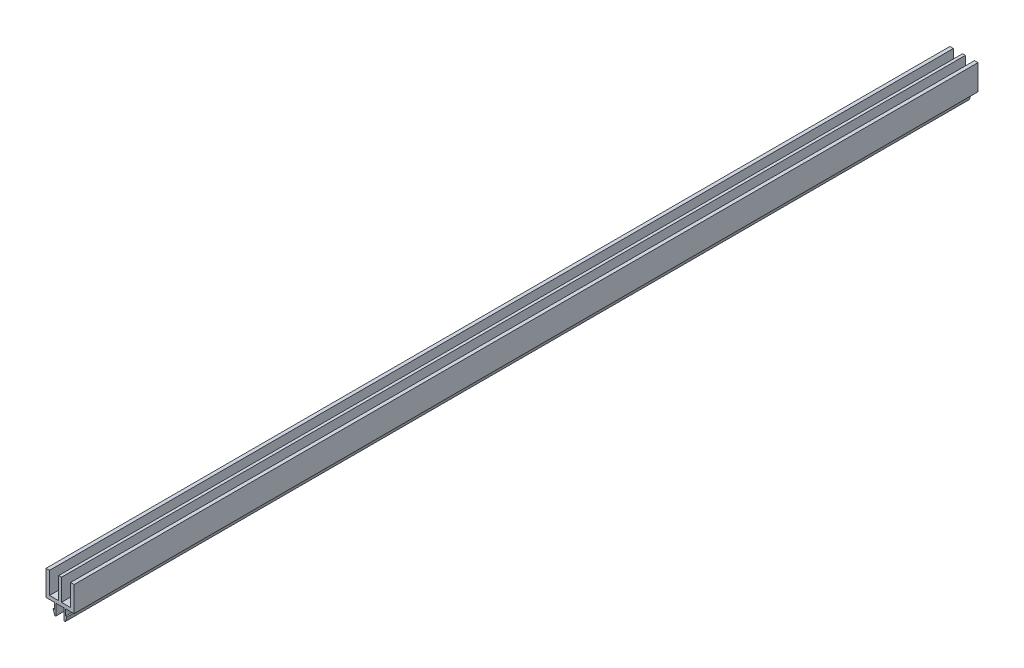
ISO-10303-21;
HEADER;
FILE_DESCRIPTION(('STEP AP214'),'2;1');
FILE_NAME('part.step','',(''),(''),'','','');
FILE_SCHEMA(('AUTOMOTIVE_DESIGN { 1 0 10303 214 1 1 1 1 }'));
ENDSEC;
DATA;
#1=APPLICATION_CONTEXT('core data for automotive mechanical design processes');
#2=APPLICATION_PROTOCOL_DEFINITION('international standard','automotive_design',2000,#1);
#3=PRODUCT_CONTEXT('',#1,'mechanical');
#4=PRODUCT('Part','Part','',(#3));
#5=PRODUCT_RELATED_PRODUCT_CATEGORY('part','',(#4));
#6=PRODUCT_DEFINITION_FORMATION('','',#4);
#7=PRODUCT_DEFINITION_CONTEXT('part definition',#1,'design');
#8=PRODUCT_DEFINITION('design','',#6,#7);
#9=PRODUCT_DEFINITION_SHAPE('','',#8);
#10=(LENGTH_UNIT() NAMED_UNIT(*) SI_UNIT(.MILLI.,.METRE.));
#11=(NAMED_UNIT(*) PLANE_ANGLE_UNIT() SI_UNIT($,.RADIAN.));
#12=(NAMED_UNIT(*) SI_UNIT($,.STERADIAN.) SOLID_ANGLE_UNIT());
#13=UNCERTAINTY_MEASURE_WITH_UNIT(LENGTH_MEASURE(1.E-05),#10,'distance_accuracy_value','');
#14=(GEOMETRIC_REPRESENTATION_CONTEXT(3) GLOBAL_UNCERTAINTY_ASSIGNED_CONTEXT((#13)) GLOBAL_UNIT_ASSIGNED_CONTEXT((#10,
#11,#12)) REPRESENTATION_CONTEXT('',''));
#15=CARTESIAN_POINT('',(0.,0.,0.));
#16=DIRECTION('',(0.,0.,1.));
#17=DIRECTION('',(1.,0.,0.));
#18=AXIS2_PLACEMENT_3D('',#15,#16,#17);
#19=CARTESIAN_POINT('',(-1.,17.9999999975,-594.));
#20=DIRECTION('',(-1.,0.,0.));
#21=DIRECTION('',(0.,-1.,0.));
#22=AXIS2_PLACEMENT_3D('',#19,#20,#21);
#23=PLANE('',#22);
#24=DIRECTION('',(0.,-1.,0.));
#25=VECTOR('',#24,1.);
#26=CARTESIAN_POINT('',(-1.,17.9999999975,50.));
#27=LINE('',#26,#25);
#28=CARTESIAN_POINT('',(-1.,17.9999999975,50.));
#29=VERTEX_POINT('',#28);
#30=CARTESIAN_POINT('',(-1.,2.4999999995,50.));
#31=VERTEX_POINT('',#30);
#32=EDGE_CURVE('E225',#29,#31,#27,.T.);
#33=ORIENTED_EDGE('',*,*,#32,.F.);
#34=DIRECTION('',(0.,0.,1.));
#35=VECTOR('',#34,1.);
#36=CARTESIAN_POINT('',(-1.,17.9999999975,-594.));
#37=LINE('',#36,#35);
#38=CARTESIAN_POINT('',(-1.,17.9999999975,-594.));
#39=VERTEX_POINT('',#38);
#40=EDGE_CURVE('E11',#39,#29,#37,.T.);
#41=ORIENTED_EDGE('',*,*,#40,.F.);
#42=DIRECTION('',(0.,-1.,0.));
#43=VECTOR('',#42,1.);
#44=CARTESIAN_POINT('',(-1.,17.9999999975,-594.));
#45=LINE('',#44,#43);
#46=CARTESIAN_POINT('',(-1.,2.4999999995,-594.));
#47=VERTEX_POINT('',#46);
#48=EDGE_CURVE('E293',#39,#47,#45,.T.);
#49=ORIENTED_EDGE('',*,*,#48,.T.);
#50=DIRECTION('',(0.,0.,1.));
#51=VECTOR('',#50,1.);
#52=CARTESIAN_POINT('',(-1.,2.4999999995,-594.));
#53=LINE('',#52,#51);
#54=EDGE_CURVE('E35',#47,#31,#53,.T.);
#55=ORIENTED_EDGE('',*,*,#54,.T.);
#56=EDGE_LOOP('',(#33,#41,#49,#55));
#57=FACE_BOUND('',#56,.T.);
#58=ADVANCED_FACE('F32',(#57),#23,.T.);
#59=CARTESIAN_POINT('',(0.999999999999998,17.9999999975,-594.));
#60=DIRECTION('',(0.,1.,0.));
#61=DIRECTION('',(0.,0.,1.));
#62=AXIS2_PLACEMENT_3D('',#59,#60,#61);
#63=PLANE('',#62);
#64=DIRECTION('',(-1.,0.,0.));
#65=VECTOR('',#64,1.);
#66=CARTESIAN_POINT('',(0.999999999999998,17.9999999975,50.));
#67=LINE('',#66,#65);
#68=CARTESIAN_POINT('',(0.999999999999998,17.9999999975,50.));
#69=VERTEX_POINT('',#68);
#70=EDGE_CURVE('E291',#69,#29,#67,.T.);
#71=ORIENTED_EDGE('',*,*,#70,.F.);
#72=DIRECTION('',(0.,0.,1.));
#73=VECTOR('',#72,1.);
#74=CARTESIAN_POINT('',(0.999999999999998,17.9999999975,-594.));
#75=LINE('',#74,#73);
#76=CARTESIAN_POINT('',(0.999999999999998,17.9999999975,-594.));
#77=VERTEX_POINT('',#76);
#78=EDGE_CURVE('E41',#77,#69,#75,.T.);
#79=ORIENTED_EDGE('',*,*,#78,.F.);
#80=DIRECTION('',(-1.,0.,0.));
#81=VECTOR('',#80,1.);
#82=CARTESIAN_POINT('',(0.999999999999998,17.9999999975,-594.));
#83=LINE('',#82,#81);
#84=EDGE_CURVE('E215',#77,#39,#83,.T.);
#85=ORIENTED_EDGE('',*,*,#84,.T.);
#86=ORIENTED_EDGE('',*,*,#40,.T.);
#87=EDGE_LOOP('',(#71,#79,#85,#86));
#88=FACE_BOUND('',#87,.T.);
#89=ADVANCED_FACE('F337',(#88),#63,.T.);
#90=CARTESIAN_POINT('',(0.999999999999998,2.4999999995,-594.));
#91=DIRECTION('',(1.,0.,0.));
#92=DIRECTION('',(0.,0.,-1.));
#93=AXIS2_PLACEMENT_3D('',#90,#91,#92);
#94=PLANE('',#93);
#95=DIRECTION('',(0.,1.,0.));
#96=VECTOR('',#95,1.);
#97=CARTESIAN_POINT('',(0.999999999999998,2.4999999995,50.));
#98=LINE('',#97,#96);
#99=CARTESIAN_POINT('',(0.999999999999998,2.4999999995,50.));
#100=VERTEX_POINT('',#99);
#101=EDGE_CURVE('E202',#100,#69,#98,.T.);
#102=ORIENTED_EDGE('',*,*,#101,.F.);
#103=DIRECTION('',(0.,0.,1.));
#104=VECTOR('',#103,1.);
#105=CARTESIAN_POINT('',(0.999999999999998,2.4999999995,-594.));
#106=LINE('',#105,#104);
#107=CARTESIAN_POINT('',(0.999999999999998,2.4999999995,-594.));
#108=VERTEX_POINT('',#107);
#109=EDGE_CURVE('E197',#108,#100,#106,.T.);
#110=ORIENTED_EDGE('',*,*,#109,.F.);
#111=DIRECTION('',(0.,1.,0.));
#112=VECTOR('',#111,1.);
#113=CARTESIAN_POINT('',(0.999999999999998,2.4999999995,-594.));
#114=LINE('',#113,#112);
#115=EDGE_CURVE('E200',#108,#77,#114,.T.);
#116=ORIENTED_EDGE('',*,*,#115,.T.);
#117=ORIENTED_EDGE('',*,*,#78,.T.);
#118=EDGE_LOOP('',(#102,#110,#116,#117));
#119=FACE_BOUND('',#118,.T.);
#120=ADVANCED_FACE('F199',(#119),#94,.T.);
#121=CARTESIAN_POINT('',(7.5,2.4999999995,-594.));
#122=DIRECTION('',(0.,1.,0.));
#123=DIRECTION('',(-1.,0.,0.));
#124=AXIS2_PLACEMENT_3D('',#121,#122,#123);
#125=PLANE('',#124);
#126=DIRECTION('',(-1.,0.,0.));
#127=VECTOR('',#126,1.);
#128=CARTESIAN_POINT('',(7.5,2.4999999995,50.));
#129=LINE('',#128,#127);
#130=CARTESIAN_POINT('',(7.5,2.4999999995,50.));
#131=VERTEX_POINT('',#130);
#132=EDGE_CURVE('E288',#131,#100,#129,.T.);
#133=ORIENTED_EDGE('',*,*,#132,.F.);
#134=DIRECTION('',(0.,0.,1.));
#135=VECTOR('',#134,1.);
#136=CARTESIAN_POINT('',(7.5,2.4999999995,-594.));
#137=LINE('',#136,#135);
#138=CARTESIAN_POINT('',(7.5,2.4999999995,-594.));
#139=VERTEX_POINT('',#138);
#140=EDGE_CURVE('E207',#139,#131,#137,.T.);
#141=ORIENTED_EDGE('',*,*,#140,.F.);
#142=DIRECTION('',(-1.,0.,0.));
#143=VECTOR('',#142,1.);
#144=CARTESIAN_POINT('',(7.5,2.4999999995,-594.));
#145=LINE('',#144,#143);
#146=EDGE_CURVE('E213',#139,#108,#145,.T.);
#147=ORIENTED_EDGE('',*,*,#146,.T.);
#148=ORIENTED_EDGE('',*,*,#109,.T.);
#149=EDGE_LOOP('',(#133,#141,#147,#148));
#150=FACE_BOUND('',#149,.T.);
#151=ADVANCED_FACE('F217',(#150),#125,.T.);
#152=CARTESIAN_POINT('',(7.5,17.9999999975,-594.));
#153=DIRECTION('',(-1.,0.,0.));
#154=DIRECTION('',(0.,-1.,0.));
#155=AXIS2_PLACEMENT_3D('',#152,#153,#154);
#156=PLANE('',#155);
#157=DIRECTION('',(0.,-1.,0.));
#158=VECTOR('',#157,1.);
#159=CARTESIAN_POINT('',(7.5,17.9999999975,50.));
#160=LINE('',#159,#158);
#161=CARTESIAN_POINT('',(7.5,17.9999999975,50.));
#162=VERTEX_POINT('',#161);
#163=EDGE_CURVE('E285',#162,#131,#160,.T.);
#164=ORIENTED_EDGE('',*,*,#163,.F.);
#165=DIRECTION('',(0.,0.,1.));
#166=VECTOR('',#165,1.);
#167=CARTESIAN_POINT('',(7.5,17.9999999975,-594.));
#168=LINE('',#167,#166);
#169=CARTESIAN_POINT('',(7.5,17.9999999975,-594.));
#170=VERTEX_POINT('',#169);
#171=EDGE_CURVE('E297',#170,#162,#168,.T.);
#172=ORIENTED_EDGE('',*,*,#171,.F.);
#173=DIRECTION('',(0.,-1.,0.));
#174=VECTOR('',#173,1.);
#175=CARTESIAN_POINT('',(7.5,17.9999999975,-594.));
#176=LINE('',#175,#174);
#177=EDGE_CURVE('E218',#170,#139,#176,.T.);
#178=ORIENTED_EDGE('',*,*,#177,.T.);
#179=ORIENTED_EDGE('',*,*,#140,.T.);
#180=EDGE_LOOP('',(#164,#172,#178,#179));
#181=FACE_BOUND('',#180,.T.);
#182=ADVANCED_FACE('F350',(#181),#156,.T.);
#183=CARTESIAN_POINT('',(10.,17.9999999975,-594.));
#184=DIRECTION('',(0.,1.,0.));
#185=DIRECTION('',(0.,0.,1.));
#186=AXIS2_PLACEMENT_3D('',#183,#184,#185);
#187=PLANE('',#186);
#188=DIRECTION('',(-1.,0.,0.));
#189=VECTOR('',#188,1.);
#190=CARTESIAN_POINT('',(10.,17.9999999975,50.));
#191=LINE('',#190,#189);
#192=CARTESIAN_POINT('',(10.,17.9999999975,50.));
#193=VERTEX_POINT('',#192);
#194=EDGE_CURVE('E282',#193,#162,#191,.T.);
#195=ORIENTED_EDGE('',*,*,#194,.F.);
#196=DIRECTION('',(0.,0.,1.));
#197=VECTOR('',#196,1.);
#198=CARTESIAN_POINT('',(10.,17.9999999975,-594.));
#199=LINE('',#198,#197);
#200=CARTESIAN_POINT('',(10.,17.9999999975,-594.));
#201=VERTEX_POINT('',#200);
#202=EDGE_CURVE('E299',#201,#193,#199,.T.);
#203=ORIENTED_EDGE('',*,*,#202,.F.);
#204=DIRECTION('',(-1.,0.,0.));
#205=VECTOR('',#204,1.);
#206=CARTESIAN_POINT('',(10.,17.9999999975,-594.));
#207=LINE('',#206,#205);
#208=EDGE_CURVE('E220',#201,#170,#207,.T.);
#209=ORIENTED_EDGE('',*,*,#208,.T.);
#210=ORIENTED_EDGE('',*,*,#171,.T.);
#211=EDGE_LOOP('',(#195,#203,#209,#210));
#212=FACE_BOUND('',#211,.T.);
#213=ADVANCED_FACE('F353',(#212),#187,.T.);
#214=CARTESIAN_POINT('',(10.,-4.99999828349541E-10,-594.));
#215=DIRECTION('',(1.,0.,0.));
#216=DIRECTION('',(0.,0.,-1.));
#217=AXIS2_PLACEMENT_3D('',#214,#215,#216);
#218=PLANE('',#217);
#219=DIRECTION('',(0.,1.,0.));
#220=VECTOR('',#219,1.);
#221=CARTESIAN_POINT('',(10.,-4.99999828349541E-10,50.));
#222=LINE('',#221,#220);
#223=CARTESIAN_POINT('',(10.,-4.99999828349541E-10,50.));
#224=VERTEX_POINT('',#223);
#225=EDGE_CURVE('E279',#224,#193,#222,.T.);
#226=ORIENTED_EDGE('',*,*,#225,.F.);
#227=DIRECTION('',(0.,0.,1.));
#228=VECTOR('',#227,1.);
#229=CARTESIAN_POINT('',(10.,-4.99999828349541E-10,-594.));
#230=LINE('',#229,#228);
#231=CARTESIAN_POINT('',(10.,-4.99999828349541E-10,-594.));
#232=VERTEX_POINT('',#231);
#233=EDGE_CURVE('E301',#232,#224,#230,.T.);
#234=ORIENTED_EDGE('',*,*,#233,.F.);
#235=DIRECTION('',(0.,1.,0.));
#236=VECTOR('',#235,1.);
#237=CARTESIAN_POINT('',(10.,-4.99999828349541E-10,-594.));
#238=LINE('',#237,#236);
#239=EDGE_CURVE('E643',#232,#201,#238,.T.);
#240=ORIENTED_EDGE('',*,*,#239,.T.);
#241=ORIENTED_EDGE('',*,*,#202,.T.);
#242=EDGE_LOOP('',(#226,#234,#240,#241));
#243=FACE_BOUND('',#242,.T.);
#244=ADVANCED_FACE('F357',(#243),#218,.T.);
#245=CARTESIAN_POINT('',(4.,-4.99999998002099E-10,-594.));
#246=DIRECTION('',(0.,-1.,0.));
#247=DIRECTION('',(1.,0.,0.));
#248=AXIS2_PLACEMENT_3D('',#245,#246,#247);
#249=PLANE('',#248);
#250=DIRECTION('',(1.,0.,0.));
#251=VECTOR('',#250,1.);
#252=CARTESIAN_POINT('',(4.,-4.99999998002099E-10,50.));
#253=LINE('',#252,#251);
#254=CARTESIAN_POINT('',(4.,-4.99999998002099E-10,50.));
#255=VERTEX_POINT('',#254);
#256=EDGE_CURVE('E276',#255,#224,#253,.T.);
#257=ORIENTED_EDGE('',*,*,#256,.F.);
#258=DIRECTION('',(0.,0.,1.));
#259=VECTOR('',#258,1.);
#260=CARTESIAN_POINT('',(4.,-4.99999998002099E-10,-594.));
#261=LINE('',#260,#259);
#262=CARTESIAN_POINT('',(4.,-4.99999998002099E-10,-594.));
#263=VERTEX_POINT('',#262);
#264=EDGE_CURVE('E303',#263,#255,#261,.T.);
#265=ORIENTED_EDGE('',*,*,#264,.F.);
#266=DIRECTION('',(1.,0.,0.));
#267=VECTOR('',#266,1.);
#268=CARTESIAN_POINT('',(4.,-4.99999998002099E-10,-594.));
#269=LINE('',#268,#267);
#270=EDGE_CURVE('E647',#263,#232,#269,.T.);
#271=ORIENTED_EDGE('',*,*,#270,.T.);
#272=ORIENTED_EDGE('',*,*,#233,.T.);
#273=EDGE_LOOP('',(#257,#265,#271,#272));
#274=FACE_BOUND('',#273,.T.);
#275=ADVANCED_FACE('F361',(#274),#249,.T.);
#276=CARTESIAN_POINT('',(4.,-4.5,-594.));
#277=DIRECTION('',(1.,0.,0.));
#278=DIRECTION('',(0.,0.,-1.));
#279=AXIS2_PLACEMENT_3D('',#276,#277,#278);
#280=PLANE('',#279);
#281=DIRECTION('',(0.,1.,0.));
#282=VECTOR('',#281,1.);
#283=CARTESIAN_POINT('',(4.,-4.5,50.));
#284=LINE('',#283,#282);
#285=CARTESIAN_POINT('',(4.,-4.5,50.));
#286=VERTEX_POINT('',#285);
#287=EDGE_CURVE('E273',#286,#255,#284,.T.);
#288=ORIENTED_EDGE('',*,*,#287,.F.);
#289=DIRECTION('',(0.,0.,1.));
#290=VECTOR('',#289,1.);
#291=CARTESIAN_POINT('',(4.,-4.5,-594.));
#292=LINE('',#291,#290);
#293=CARTESIAN_POINT('',(4.,-4.5,-594.));
#294=VERTEX_POINT('',#293);
#295=EDGE_CURVE('E305',#294,#286,#292,.T.);
#296=ORIENTED_EDGE('',*,*,#295,.F.);
#297=DIRECTION('',(0.,1.,0.));
#298=VECTOR('',#297,1.);
#299=CARTESIAN_POINT('',(4.,-4.5,-594.));
#300=LINE('',#299,#298);
#301=EDGE_CURVE('E636',#294,#263,#300,.T.);
#302=ORIENTED_EDGE('',*,*,#301,.T.);
#303=ORIENTED_EDGE('',*,*,#264,.T.);
#304=EDGE_LOOP('',(#288,#296,#302,#303));
#305=FACE_BOUND('',#304,.T.);
#306=ADVANCED_FACE('F365',(#305),#280,.T.);
#307=CARTESIAN_POINT('',(5.,-4.5,-594.));
#308=DIRECTION('',(0.,1.,0.));
#309=DIRECTION('',(0.,0.,1.));
#310=AXIS2_PLACEMENT_3D('',#307,#308,#309);
#311=PLANE('',#310);
#312=DIRECTION('',(-1.,0.,0.));
#313=VECTOR('',#312,1.);
#314=CARTESIAN_POINT('',(5.,-4.5,50.));
#315=LINE('',#314,#313);
#316=CARTESIAN_POINT('',(5.,-4.5,50.));
#317=VERTEX_POINT('',#316);
#318=EDGE_CURVE('E270',#317,#286,#315,.T.);
#319=ORIENTED_EDGE('',*,*,#318,.F.);
#320=DIRECTION('',(0.,0.,1.));
#321=VECTOR('',#320,1.);
#322=CARTESIAN_POINT('',(5.,-4.5,-594.));
#323=LINE('',#322,#321);
#324=CARTESIAN_POINT('',(5.,-4.5,-594.));
#325=VERTEX_POINT('',#324);
#326=EDGE_CURVE('E307',#325,#317,#323,.T.);
#327=ORIENTED_EDGE('',*,*,#326,.F.);
#328=DIRECTION('',(-1.,0.,0.));
#329=VECTOR('',#328,1.);
#330=CARTESIAN_POINT('',(5.,-4.5,-594.));
#331=LINE('',#330,#329);
#332=EDGE_CURVE('E632',#325,#294,#331,.T.);
#333=ORIENTED_EDGE('',*,*,#332,.T.);
#334=ORIENTED_EDGE('',*,*,#295,.T.);
#335=EDGE_LOOP('',(#319,#327,#333,#334));
#336=FACE_BOUND('',#335,.T.);
#337=ADVANCED_FACE('F369',(#336),#311,.T.);
#338=CARTESIAN_POINT('',(3.75,-8.,-594.));
#339=DIRECTION('',(0.941741911594837,-0.336336396998156,0.));
#340=DIRECTION('',(0.336336396998156,0.941741911594837,0.));
#341=AXIS2_PLACEMENT_3D('',#338,#339,#340);
#342=PLANE('',#341);
#343=DIRECTION('',(0.336336396998157,0.941741911594837,0.));
#344=VECTOR('',#343,1.);
#345=CARTESIAN_POINT('',(3.75,-8.,50.));
#346=LINE('',#345,#344);
#347=CARTESIAN_POINT('',(3.75,-8.,50.));
#348=VERTEX_POINT('',#347);
#349=EDGE_CURVE('E267',#348,#317,#346,.T.);
#350=ORIENTED_EDGE('',*,*,#349,.F.);
#351=DIRECTION('',(0.,0.,1.));
#352=VECTOR('',#351,1.);
#353=CARTESIAN_POINT('',(3.75,-8.,-594.));
#354=LINE('',#353,#352);
#355=CARTESIAN_POINT('',(3.75,-8.,-594.));
#356=VERTEX_POINT('',#355);
#357=EDGE_CURVE('E309',#356,#348,#354,.T.);
#358=ORIENTED_EDGE('',*,*,#357,.F.);
#359=DIRECTION('',(0.336336396998157,0.941741911594837,0.));
#360=VECTOR('',#359,1.);
#361=CARTESIAN_POINT('',(3.75,-8.,-594.));
#362=LINE('',#361,#360);
#363=EDGE_CURVE('E653',#356,#325,#362,.T.);
#364=ORIENTED_EDGE('',*,*,#363,.T.);
#365=ORIENTED_EDGE('',*,*,#326,.T.);
#366=EDGE_LOOP('',(#350,#358,#364,#365));
#367=FACE_BOUND('',#366,.T.);
#368=ADVANCED_FACE('F373',(#367),#342,.T.);
#369=CARTESIAN_POINT('',(3.,-8.,-594.));
#370=DIRECTION('',(0.,-1.,0.));
#371=DIRECTION('',(0.,0.,-1.));
#372=AXIS2_PLACEMENT_3D('',#369,#370,#371);
#373=PLANE('',#372);
#374=DIRECTION('',(1.,0.,0.));
#375=VECTOR('',#374,1.);
#376=CARTESIAN_POINT('',(3.,-8.,50.));
#377=LINE('',#376,#375);
#378=CARTESIAN_POINT('',(3.,-8.,50.));
#379=VERTEX_POINT('',#378);
#380=EDGE_CURVE('E264',#379,#348,#377,.T.);
#381=ORIENTED_EDGE('',*,*,#380,.F.);
#382=DIRECTION('',(0.,0.,1.));
#383=VECTOR('',#382,1.);
#384=CARTESIAN_POINT('',(3.,-8.,-594.));
#385=LINE('',#384,#383);
#386=CARTESIAN_POINT('',(3.,-8.,-594.));
#387=VERTEX_POINT('',#386);
#388=EDGE_CURVE('E311',#387,#379,#385,.T.);
#389=ORIENTED_EDGE('',*,*,#388,.F.);
#390=DIRECTION('',(1.,0.,0.));
#391=VECTOR('',#390,1.);
#392=CARTESIAN_POINT('',(3.,-8.,-594.));
#393=LINE('',#392,#391);
#394=EDGE_CURVE('E625',#387,#356,#393,.T.);
#395=ORIENTED_EDGE('',*,*,#394,.T.);
#396=ORIENTED_EDGE('',*,*,#357,.T.);
#397=EDGE_LOOP('',(#381,#389,#395,#396));
#398=FACE_BOUND('',#397,.T.);
#399=ADVANCED_FACE('F377',(#398),#373,.T.);
#400=CARTESIAN_POINT('',(3.,-4.9999985194348E-10,-594.));
#401=DIRECTION('',(-1.,0.,0.));
#402=DIRECTION('',(0.,0.,1.));
#403=AXIS2_PLACEMENT_3D('',#400,#401,#402);
#404=PLANE('',#403);
#405=DIRECTION('',(0.,-1.,0.));
#406=VECTOR('',#405,1.);
#407=CARTESIAN_POINT('',(3.,-4.9999985194348E-10,50.));
#408=LINE('',#407,#406);
#409=CARTESIAN_POINT('',(3.,-4.9999985194348E-10,50.));
#410=VERTEX_POINT('',#409);
#411=EDGE_CURVE('E261',#410,#379,#408,.T.);
#412=ORIENTED_EDGE('',*,*,#411,.F.);
#413=DIRECTION('',(0.,0.,1.));
#414=VECTOR('',#413,1.);
#415=CARTESIAN_POINT('',(3.,-4.9999985194348E-10,-594.));
#416=LINE('',#415,#414);
#417=CARTESIAN_POINT('',(3.,-4.9999985194348E-10,-594.));
#418=VERTEX_POINT('',#417);
#419=EDGE_CURVE('E313',#418,#410,#416,.T.);
#420=ORIENTED_EDGE('',*,*,#419,.F.);
#421=DIRECTION('',(0.,-1.,0.));
#422=VECTOR('',#421,1.);
#423=CARTESIAN_POINT('',(3.,-4.9999985194348E-10,-594.));
#424=LINE('',#423,#422);
#425=EDGE_CURVE('E621',#418,#387,#424,.T.);
#426=ORIENTED_EDGE('',*,*,#425,.T.);
#427=ORIENTED_EDGE('',*,*,#388,.T.);
#428=EDGE_LOOP('',(#412,#420,#426,#427));
#429=FACE_BOUND('',#428,.T.);
#430=ADVANCED_FACE('F381',(#429),#404,.T.);
#431=CARTESIAN_POINT('',(-3.,-4.99999455901012E-10,-594.));
#432=DIRECTION('',(0.,-1.,0.));
#433=DIRECTION('',(1.,0.,0.));
#434=AXIS2_PLACEMENT_3D('',#431,#432,#433);
#435=PLANE('',#434);
#436=DIRECTION('',(1.,0.,0.));
#437=VECTOR('',#436,1.);
#438=CARTESIAN_POINT('',(-3.,-4.99999455901012E-10,50.));
#439=LINE('',#438,#437);
#440=CARTESIAN_POINT('',(-3.,-4.99999455901012E-10,50.));
#441=VERTEX_POINT('',#440);
#442=EDGE_CURVE('E258',#441,#410,#439,.T.);
#443=ORIENTED_EDGE('',*,*,#442,.F.);
#444=DIRECTION('',(0.,0.,1.));
#445=VECTOR('',#444,1.);
#446=CARTESIAN_POINT('',(-3.,-4.99999455901012E-10,-594.));
#447=LINE('',#446,#445);
#448=CARTESIAN_POINT('',(-3.,-4.99999455901012E-10,-594.));
#449=VERTEX_POINT('',#448);
#450=EDGE_CURVE('E315',#449,#441,#447,.T.);
#451=ORIENTED_EDGE('',*,*,#450,.F.);
#452=DIRECTION('',(1.,0.,0.));
#453=VECTOR('',#452,1.);
#454=CARTESIAN_POINT('',(-3.,-4.99999455901012E-10,-594.));
#455=LINE('',#454,#453);
#456=EDGE_CURVE('E657',#449,#418,#455,.T.);
#457=ORIENTED_EDGE('',*,*,#456,.T.);
#458=ORIENTED_EDGE('',*,*,#419,.T.);
#459=EDGE_LOOP('',(#443,#451,#457,#458));
#460=FACE_BOUND('',#459,.T.);
#461=ADVANCED_FACE('F385',(#460),#435,.T.);
#462=CARTESIAN_POINT('',(-3.,-8.,-594.));
#463=DIRECTION('',(1.,0.,0.));
#464=DIRECTION('',(0.,0.,-1.));
#465=AXIS2_PLACEMENT_3D('',#462,#463,#464);
#466=PLANE('',#465);
#467=DIRECTION('',(0.,1.,0.));
#468=VECTOR('',#467,1.);
#469=CARTESIAN_POINT('',(-3.,-8.,50.));
#470=LINE('',#469,#468);
#471=CARTESIAN_POINT('',(-3.,-8.,50.));
#472=VERTEX_POINT('',#471);
#473=EDGE_CURVE('E255',#472,#441,#470,.T.);
#474=ORIENTED_EDGE('',*,*,#473,.F.);
#475=DIRECTION('',(0.,0.,1.));
#476=VECTOR('',#475,1.);
#477=CARTESIAN_POINT('',(-3.,-8.,-594.));
#478=LINE('',#477,#476);
#479=CARTESIAN_POINT('',(-3.,-8.,-594.));
#480=VERTEX_POINT('',#479);
#481=EDGE_CURVE('E317',#480,#472,#478,.T.);
#482=ORIENTED_EDGE('',*,*,#481,.F.);
#483=DIRECTION('',(0.,1.,0.));
#484=VECTOR('',#483,1.);
#485=CARTESIAN_POINT('',(-3.,-8.,-594.));
#486=LINE('',#485,#484);
#487=EDGE_CURVE('E614',#480,#449,#486,.T.);
#488=ORIENTED_EDGE('',*,*,#487,.T.);
#489=ORIENTED_EDGE('',*,*,#450,.T.);
#490=EDGE_LOOP('',(#474,#482,#488,#489));
#491=FACE_BOUND('',#490,.T.);
#492=ADVANCED_FACE('F389',(#491),#466,.T.);
#493=CARTESIAN_POINT('',(-3.75,-8.,-594.));
#494=DIRECTION('',(0.,-1.,0.));
#495=DIRECTION('',(0.,0.,-1.));
#496=AXIS2_PLACEMENT_3D('',#493,#494,#495);
#497=PLANE('',#496);
#498=DIRECTION('',(1.,0.,0.));
#499=VECTOR('',#498,1.);
#500=CARTESIAN_POINT('',(-3.75,-8.,50.));
#501=LINE('',#500,#499);
#502=CARTESIAN_POINT('',(-3.75,-8.,50.));
#503=VERTEX_POINT('',#502);
#504=EDGE_CURVE('E252',#503,#472,#501,.T.);
#505=ORIENTED_EDGE('',*,*,#504,.F.);
#506=DIRECTION('',(0.,0.,1.));
#507=VECTOR('',#506,1.);
#508=CARTESIAN_POINT('',(-3.75,-8.,-594.));
#509=LINE('',#508,#507);
#510=CARTESIAN_POINT('',(-3.75,-8.,-594.));
#511=VERTEX_POINT('',#510);
#512=EDGE_CURVE('E319',#511,#503,#509,.T.);
#513=ORIENTED_EDGE('',*,*,#512,.F.);
#514=DIRECTION('',(1.,0.,0.));
#515=VECTOR('',#514,1.);
#516=CARTESIAN_POINT('',(-3.75,-8.,-594.));
#517=LINE('',#516,#515);
#518=EDGE_CURVE('E610',#511,#480,#517,.T.);
#519=ORIENTED_EDGE('',*,*,#518,.T.);
#520=ORIENTED_EDGE('',*,*,#481,.T.);
#521=EDGE_LOOP('',(#505,#513,#519,#520));
#522=FACE_BOUND('',#521,.T.);
#523=ADVANCED_FACE('F393',(#522),#497,.T.);
#524=CARTESIAN_POINT('',(-5.,-4.5,-594.));
#525=DIRECTION('',(-0.941741911594837,-0.336336396998156,0.));
#526=DIRECTION('',(0.336336396998156,-0.941741911594837,0.));
#527=AXIS2_PLACEMENT_3D('',#524,#525,#526);
#528=PLANE('',#527);
#529=DIRECTION('',(0.336336396998156,-0.941741911594837,0.));
#530=VECTOR('',#529,1.);
#531=CARTESIAN_POINT('',(-5.,-4.5,50.));
#532=LINE('',#531,#530);
#533=CARTESIAN_POINT('',(-5.,-4.5,50.));
#534=VERTEX_POINT('',#533);
#535=EDGE_CURVE('E249',#534,#503,#532,.T.);
#536=ORIENTED_EDGE('',*,*,#535,.F.);
#537=DIRECTION('',(0.,0.,1.));
#538=VECTOR('',#537,1.);
#539=CARTESIAN_POINT('',(-5.,-4.5,-594.));
#540=LINE('',#539,#538);
#541=CARTESIAN_POINT('',(-5.,-4.5,-594.));
#542=VERTEX_POINT('',#541);
#543=EDGE_CURVE('E321',#542,#534,#540,.T.);
#544=ORIENTED_EDGE('',*,*,#543,.F.);
#545=DIRECTION('',(0.336336396998156,-0.941741911594837,0.));
#546=VECTOR('',#545,1.);
#547=CARTESIAN_POINT('',(-5.,-4.5,-594.));
#548=LINE('',#547,#546);
#549=EDGE_CURVE('E661',#542,#511,#548,.T.);
#550=ORIENTED_EDGE('',*,*,#549,.T.);
#551=ORIENTED_EDGE('',*,*,#512,.T.);
#552=EDGE_LOOP('',(#536,#544,#550,#551));
#553=FACE_BOUND('',#552,.T.);
#554=ADVANCED_FACE('F397',(#553),#528,.T.);
#555=CARTESIAN_POINT('',(-4.,-4.5,-594.));
#556=DIRECTION('',(0.,1.,0.));
#557=DIRECTION('',(0.,0.,1.));
#558=AXIS2_PLACEMENT_3D('',#555,#556,#557);
#559=PLANE('',#558);
#560=DIRECTION('',(-1.,0.,0.));
#561=VECTOR('',#560,1.);
#562=CARTESIAN_POINT('',(-4.,-4.5,50.));
#563=LINE('',#562,#561);
#564=CARTESIAN_POINT('',(-4.,-4.5,50.));
#565=VERTEX_POINT('',#564);
#566=EDGE_CURVE('E246',#565,#534,#563,.T.);
#567=ORIENTED_EDGE('',*,*,#566,.F.);
#568=DIRECTION('',(0.,0.,1.));
#569=VECTOR('',#568,1.);
#570=CARTESIAN_POINT('',(-4.,-4.5,-594.));
#571=LINE('',#570,#569);
#572=CARTESIAN_POINT('',(-4.,-4.5,-594.));
#573=VERTEX_POINT('',#572);
#574=EDGE_CURVE('E323',#573,#565,#571,.T.);
#575=ORIENTED_EDGE('',*,*,#574,.F.);
#576=DIRECTION('',(-1.,0.,0.));
#577=VECTOR('',#576,1.);
#578=CARTESIAN_POINT('',(-4.,-4.5,-594.));
#579=LINE('',#578,#577);
#580=EDGE_CURVE('E603',#573,#542,#579,.T.);
#581=ORIENTED_EDGE('',*,*,#580,.T.);
#582=ORIENTED_EDGE('',*,*,#543,.T.);
#583=EDGE_LOOP('',(#567,#575,#581,#582));
#584=FACE_BOUND('',#583,.T.);
#585=ADVANCED_FACE('F401',(#584),#559,.T.);
#586=CARTESIAN_POINT('',(-4.,-4.9999985194348E-10,-594.));
#587=DIRECTION('',(-1.,0.,0.));
#588=DIRECTION('',(0.,0.,1.));
#589=AXIS2_PLACEMENT_3D('',#586,#587,#588);
#590=PLANE('',#589);
#591=DIRECTION('',(0.,-1.,0.));
#592=VECTOR('',#591,1.);
#593=CARTESIAN_POINT('',(-4.,-4.9999985194348E-10,50.));
#594=LINE('',#593,#592);
#595=CARTESIAN_POINT('',(-4.,-4.9999985194348E-10,50.));
#596=VERTEX_POINT('',#595);
#597=EDGE_CURVE('E243',#596,#565,#594,.T.);
#598=ORIENTED_EDGE('',*,*,#597,.F.);
#599=DIRECTION('',(0.,0.,1.));
#600=VECTOR('',#599,1.);
#601=CARTESIAN_POINT('',(-4.,-4.9999985194348E-10,-594.));
#602=LINE('',#601,#600);
#603=CARTESIAN_POINT('',(-4.,-4.9999985194348E-10,-594.));
#604=VERTEX_POINT('',#603);
#605=EDGE_CURVE('E325',#604,#596,#602,.T.);
#606=ORIENTED_EDGE('',*,*,#605,.F.);
#607=DIRECTION('',(0.,-1.,0.));
#608=VECTOR('',#607,1.);
#609=CARTESIAN_POINT('',(-4.,-4.9999985194348E-10,-594.));
#610=LINE('',#609,#608);
#611=EDGE_CURVE('E599',#604,#573,#610,.T.);
#612=ORIENTED_EDGE('',*,*,#611,.T.);
#613=ORIENTED_EDGE('',*,*,#574,.T.);
#614=EDGE_LOOP('',(#598,#606,#612,#613));
#615=FACE_BOUND('',#614,.T.);
#616=ADVANCED_FACE('F405',(#615),#590,.T.);
#617=CARTESIAN_POINT('',(-10.,-4.99999719929324E-10,-594.));
#618=DIRECTION('',(0.,-1.,0.));
#619=DIRECTION('',(1.,0.,0.));
#620=AXIS2_PLACEMENT_3D('',#617,#618,#619);
#621=PLANE('',#620);
#622=DIRECTION('',(1.,0.,0.));
#623=VECTOR('',#622,1.);
#624=CARTESIAN_POINT('',(-10.,-4.99999719929324E-10,50.));
#625=LINE('',#624,#623);
#626=CARTESIAN_POINT('',(-10.,-4.99999719929324E-10,50.));
#627=VERTEX_POINT('',#626);
#628=EDGE_CURVE('E240',#627,#596,#625,.T.);
#629=ORIENTED_EDGE('',*,*,#628,.F.);
#630=DIRECTION('',(0.,0.,1.));
#631=VECTOR('',#630,1.);
#632=CARTESIAN_POINT('',(-10.,-4.99999719929324E-10,-594.));
#633=LINE('',#632,#631);
#634=CARTESIAN_POINT('',(-10.,-4.99999719929324E-10,-594.));
#635=VERTEX_POINT('',#634);
#636=EDGE_CURVE('E327',#635,#627,#633,.T.);
#637=ORIENTED_EDGE('',*,*,#636,.F.);
#638=DIRECTION('',(1.,0.,0.));
#639=VECTOR('',#638,1.);
#640=CARTESIAN_POINT('',(-10.,-4.99999719929324E-10,-594.));
#641=LINE('',#640,#639);
#642=EDGE_CURVE('E665',#635,#604,#641,.T.);
#643=ORIENTED_EDGE('',*,*,#642,.T.);
#644=ORIENTED_EDGE('',*,*,#605,.T.);
#645=EDGE_LOOP('',(#629,#637,#643,#644));
#646=FACE_BOUND('',#645,.T.);
#647=ADVANCED_FACE('F409',(#646),#621,.T.);
#648=CARTESIAN_POINT('',(-10.,17.9999999975,-594.));
#649=DIRECTION('',(-1.,0.,0.));
#650=DIRECTION('',(0.,-1.,0.));
#651=AXIS2_PLACEMENT_3D('',#648,#649,#650);
#652=PLANE('',#651);
#653=DIRECTION('',(0.,-1.,0.));
#654=VECTOR('',#653,1.);
#655=CARTESIAN_POINT('',(-10.,17.9999999975,50.));
#656=LINE('',#655,#654);
#657=CARTESIAN_POINT('',(-10.,17.9999999975,50.));
#658=VERTEX_POINT('',#657);
#659=EDGE_CURVE('E237',#658,#627,#656,.T.);
#660=ORIENTED_EDGE('',*,*,#659,.F.);
#661=DIRECTION('',(0.,0.,1.));
#662=VECTOR('',#661,1.);
#663=CARTESIAN_POINT('',(-10.,17.9999999975,-594.));
#664=LINE('',#663,#662);
#665=CARTESIAN_POINT('',(-10.,17.9999999975,-594.));
#666=VERTEX_POINT('',#665);
#667=EDGE_CURVE('E329',#666,#658,#664,.T.);
#668=ORIENTED_EDGE('',*,*,#667,.F.);
#669=DIRECTION('',(0.,-1.,0.));
#670=VECTOR('',#669,1.);
#671=CARTESIAN_POINT('',(-10.,17.9999999975,-594.));
#672=LINE('',#671,#670);
#673=EDGE_CURVE('E592',#666,#635,#672,.T.);
#674=ORIENTED_EDGE('',*,*,#673,.T.);
#675=ORIENTED_EDGE('',*,*,#636,.T.);
#676=EDGE_LOOP('',(#660,#668,#674,#675));
#677=FACE_BOUND('',#676,.T.);
#678=ADVANCED_FACE('F413',(#677),#652,.T.);
#679=CARTESIAN_POINT('',(-7.5,17.9999999975,-594.));
#680=DIRECTION('',(0.,1.,0.));
#681=DIRECTION('',(0.,0.,1.));
#682=AXIS2_PLACEMENT_3D('',#679,#680,#681);
#683=PLANE('',#682);
#684=DIRECTION('',(-1.,0.,0.));
#685=VECTOR('',#684,1.);
#686=CARTESIAN_POINT('',(-7.5,17.9999999975,50.));
#687=LINE('',#686,#685);
#688=CARTESIAN_POINT('',(-7.5,17.9999999975,50.));
#689=VERTEX_POINT('',#688);
#690=EDGE_CURVE('E234',#689,#658,#687,.T.);
#691=ORIENTED_EDGE('',*,*,#690,.F.);
#692=DIRECTION('',(0.,0.,1.));
#693=VECTOR('',#692,1.);
#694=CARTESIAN_POINT('',(-7.5,17.9999999975,-594.));
#695=LINE('',#694,#693);
#696=CARTESIAN_POINT('',(-7.5,17.9999999975,-594.));
#697=VERTEX_POINT('',#696);
#698=EDGE_CURVE('E331',#697,#689,#695,.T.);
#699=ORIENTED_EDGE('',*,*,#698,.F.);
#700=DIRECTION('',(-1.,0.,0.));
#701=VECTOR('',#700,1.);
#702=CARTESIAN_POINT('',(-7.5,17.9999999975,-594.));
#703=LINE('',#702,#701);
#704=EDGE_CURVE('E588',#697,#666,#703,.T.);
#705=ORIENTED_EDGE('',*,*,#704,.T.);
#706=ORIENTED_EDGE('',*,*,#667,.T.);
#707=EDGE_LOOP('',(#691,#699,#705,#706));
#708=FACE_BOUND('',#707,.T.);
#709=ADVANCED_FACE('F417',(#708),#683,.T.);
#710=CARTESIAN_POINT('',(-7.5,2.4999999995,-594.));
#711=DIRECTION('',(1.,0.,0.));
#712=DIRECTION('',(0.,0.,-1.));
#713=AXIS2_PLACEMENT_3D('',#710,#711,#712);
#714=PLANE('',#713);
#715=DIRECTION('',(0.,1.,0.));
#716=VECTOR('',#715,1.);
#717=CARTESIAN_POINT('',(-7.5,2.4999999995,50.));
#718=LINE('',#717,#716);
#719=CARTESIAN_POINT('',(-7.5,2.4999999995,50.));
#720=VERTEX_POINT('',#719);
#721=EDGE_CURVE('E231',#720,#689,#718,.T.);
#722=ORIENTED_EDGE('',*,*,#721,.F.);
#723=DIRECTION('',(0.,0.,1.));
#724=VECTOR('',#723,1.);
#725=CARTESIAN_POINT('',(-7.5,2.4999999995,-594.));
#726=LINE('',#725,#724);
#727=CARTESIAN_POINT('',(-7.5,2.4999999995,-594.));
#728=VERTEX_POINT('',#727);
#729=EDGE_CURVE('E332',#728,#720,#726,.T.);
#730=ORIENTED_EDGE('',*,*,#729,.F.);
#731=DIRECTION('',(0.,1.,0.));
#732=VECTOR('',#731,1.);
#733=CARTESIAN_POINT('',(-7.5,2.4999999995,-594.));
#734=LINE('',#733,#732);
#735=EDGE_CURVE('E669',#728,#697,#734,.T.);
#736=ORIENTED_EDGE('',*,*,#735,.T.);
#737=ORIENTED_EDGE('',*,*,#698,.T.);
#738=EDGE_LOOP('',(#722,#730,#736,#737));
#739=FACE_BOUND('',#738,.T.);
#740=ADVANCED_FACE('F421',(#739),#714,.T.);
#741=CARTESIAN_POINT('',(-1.,2.4999999995,-594.));
#742=DIRECTION('',(0.,1.,0.));
#743=DIRECTION('',(-1.,0.,0.));
#744=AXIS2_PLACEMENT_3D('',#741,#742,#743);
#745=PLANE('',#744);
#746=DIRECTION('',(-1.,0.,0.));
#747=VECTOR('',#746,1.);
#748=CARTESIAN_POINT('',(-1.,2.4999999995,50.));
#749=LINE('',#748,#747);
#750=EDGE_CURVE('E228',#31,#720,#749,.T.);
#751=ORIENTED_EDGE('',*,*,#750,.F.);
#752=ORIENTED_EDGE('',*,*,#54,.F.);
#753=DIRECTION('',(-1.,0.,0.));
#754=VECTOR('',#753,1.);
#755=CARTESIAN_POINT('',(-1.,2.4999999995,-594.));
#756=LINE('',#755,#754);
#757=EDGE_CURVE('E671',#47,#728,#756,.T.);
#758=ORIENTED_EDGE('',*,*,#757,.T.);
#759=ORIENTED_EDGE('',*,*,#729,.T.);
#760=EDGE_LOOP('',(#751,#752,#758,#759));
#761=FACE_BOUND('',#760,.T.);
#762=ADVANCED_FACE('F334',(#761),#745,.T.);
#763=CARTESIAN_POINT('',(0.,0.,-594.));
#764=DIRECTION('',(0.,0.,-1.));
#765=DIRECTION('',(-1.,0.,0.));
#766=AXIS2_PLACEMENT_3D('',#763,#764,#765);
#767=PLANE('',#766);
#768=ORIENTED_EDGE('',*,*,#48,.F.);
#769=ORIENTED_EDGE('',*,*,#84,.F.);
#770=ORIENTED_EDGE('',*,*,#115,.F.);
#771=ORIENTED_EDGE('',*,*,#146,.F.);
#772=ORIENTED_EDGE('',*,*,#177,.F.);
#773=ORIENTED_EDGE('',*,*,#208,.F.);
#774=ORIENTED_EDGE('',*,*,#239,.F.);
#775=ORIENTED_EDGE('',*,*,#270,.F.);
#776=ORIENTED_EDGE('',*,*,#301,.F.);
#777=ORIENTED_EDGE('',*,*,#332,.F.);
#778=ORIENTED_EDGE('',*,*,#363,.F.);
#779=ORIENTED_EDGE('',*,*,#394,.F.);
#780=ORIENTED_EDGE('',*,*,#425,.F.);
#781=ORIENTED_EDGE('',*,*,#456,.F.);
#782=ORIENTED_EDGE('',*,*,#487,.F.);
#783=ORIENTED_EDGE('',*,*,#518,.F.);
#784=ORIENTED_EDGE('',*,*,#549,.F.);
#785=ORIENTED_EDGE('',*,*,#580,.F.);
#786=ORIENTED_EDGE('',*,*,#611,.F.);
#787=ORIENTED_EDGE('',*,*,#642,.F.);
#788=ORIENTED_EDGE('',*,*,#673,.F.);
#789=ORIENTED_EDGE('',*,*,#704,.F.);
#790=ORIENTED_EDGE('',*,*,#735,.F.);
#791=ORIENTED_EDGE('',*,*,#757,.F.);
#792=EDGE_LOOP('',(#768,#769,#770,#771,#772,#773,#774,#775,#776,#777,#778,#779,#780,#781,#782,
#783,#784,#785,#786,#787,#788,#789,#790,#791));
#793=FACE_BOUND('',#792,.T.);
#794=ADVANCED_FACE('F211',(#793),#767,.T.);
#795=CARTESIAN_POINT('',(0.,0.,50.));
#796=DIRECTION('',(0.,0.,-1.));
#797=DIRECTION('',(-1.,0.,0.));
#798=AXIS2_PLACEMENT_3D('',#795,#796,#797);
#799=PLANE('',#798);
#800=ORIENTED_EDGE('',*,*,#32,.T.);
#801=ORIENTED_EDGE('',*,*,#750,.T.);
#802=ORIENTED_EDGE('',*,*,#721,.T.);
#803=ORIENTED_EDGE('',*,*,#690,.T.);
#804=ORIENTED_EDGE('',*,*,#659,.T.);
#805=ORIENTED_EDGE('',*,*,#628,.T.);
#806=ORIENTED_EDGE('',*,*,#597,.T.);
#807=ORIENTED_EDGE('',*,*,#566,.T.);
#808=ORIENTED_EDGE('',*,*,#535,.T.);
#809=ORIENTED_EDGE('',*,*,#504,.T.);
#810=ORIENTED_EDGE('',*,*,#473,.T.);
#811=ORIENTED_EDGE('',*,*,#442,.T.);
#812=ORIENTED_EDGE('',*,*,#411,.T.);
#813=ORIENTED_EDGE('',*,*,#380,.T.);
#814=ORIENTED_EDGE('',*,*,#349,.T.);
#815=ORIENTED_EDGE('',*,*,#318,.T.);
#816=ORIENTED_EDGE('',*,*,#287,.T.);
#817=ORIENTED_EDGE('',*,*,#256,.T.);
#818=ORIENTED_EDGE('',*,*,#225,.T.);
#819=ORIENTED_EDGE('',*,*,#194,.T.);
#820=ORIENTED_EDGE('',*,*,#163,.T.);
#821=ORIENTED_EDGE('',*,*,#132,.T.);
#822=ORIENTED_EDGE('',*,*,#101,.T.);
#823=ORIENTED_EDGE('',*,*,#70,.T.);
#824=EDGE_LOOP('',(#800,#801,#802,#803,#804,#805,#806,#807,#808,#809,#810,#811,#812,#813,#814,
#815,#816,#817,#818,#819,#820,#821,#822,#823));
#825=FACE_BOUND('',#824,.T.);
#826=ADVANCED_FACE('F336',(#825),#799,.F.);
#827=CLOSED_SHELL('',(#58,#89,#120,#151,#182,#213,#244,#275,#306,#337,#368,#399,#430,#461,#492,
#523,#554,#585,#616,#647,#678,#709,#740,#762,#794,#826));
#828=MANIFOLD_SOLID_BREP('B2',#827);
#829=ADVANCED_BREP_SHAPE_REPRESENTATION('',(#18,#828),#14);
#830=SHAPE_DEFINITION_REPRESENTATION(#9,#829);
ENDSEC;
END-ISO-10303-21;
